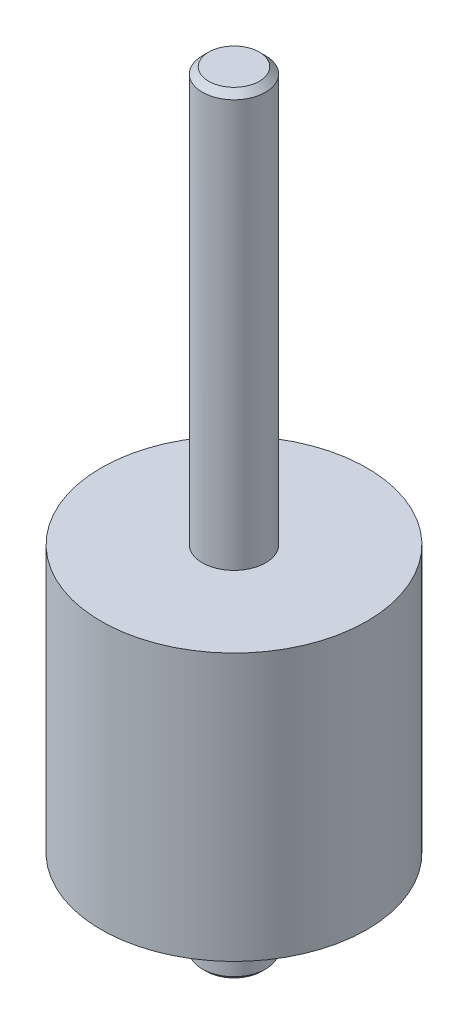
ISO-10303-21;
HEADER;
FILE_DESCRIPTION(('STEP AP214'),'2;1');
FILE_NAME('part.step','',(''),(''),'','','');
FILE_SCHEMA(('AUTOMOTIVE_DESIGN { 1 0 10303 214 1 1 1 1 }'));
ENDSEC;
DATA;
#1=APPLICATION_CONTEXT('core data for automotive mechanical design processes');
#2=APPLICATION_PROTOCOL_DEFINITION('international standard','automotive_design',2000,#1);
#3=PRODUCT_CONTEXT('',#1,'mechanical');
#4=PRODUCT('Part','Part','',(#3));
#5=PRODUCT_RELATED_PRODUCT_CATEGORY('part','',(#4));
#6=PRODUCT_DEFINITION_FORMATION('','',#4);
#7=PRODUCT_DEFINITION_CONTEXT('part definition',#1,'design');
#8=PRODUCT_DEFINITION('design','',#6,#7);
#9=PRODUCT_DEFINITION_SHAPE('','',#8);
#10=(LENGTH_UNIT() NAMED_UNIT(*) SI_UNIT(.MILLI.,.METRE.));
#11=(NAMED_UNIT(*) PLANE_ANGLE_UNIT() SI_UNIT($,.RADIAN.));
#12=(NAMED_UNIT(*) SI_UNIT($,.STERADIAN.) SOLID_ANGLE_UNIT());
#13=UNCERTAINTY_MEASURE_WITH_UNIT(LENGTH_MEASURE(1.E-05),#10,'distance_accuracy_value','');
#14=(GEOMETRIC_REPRESENTATION_CONTEXT(3) GLOBAL_UNCERTAINTY_ASSIGNED_CONTEXT((#13)) GLOBAL_UNIT_ASSIGNED_CONTEXT((#10,
#11,#12)) REPRESENTATION_CONTEXT('',''));
#15=CARTESIAN_POINT('',(0.,0.,0.));
#16=DIRECTION('',(0.,0.,1.));
#17=DIRECTION('',(1.,0.,0.));
#18=AXIS2_PLACEMENT_3D('',#15,#16,#17);
#19=CARTESIAN_POINT('',(0.,-38.6,0.));
#20=DIRECTION('',(0.,1.,0.));
#21=DIRECTION('',(-1.,0.,0.));
#22=AXIS2_PLACEMENT_3D('',#19,#20,#21);
#23=PLANE('',#22);
#24=CARTESIAN_POINT('',(0.,-38.6,0.));
#25=DIRECTION('',(0.,1.,0.));
#26=DIRECTION('',(-1.,0.,0.));
#27=AXIS2_PLACEMENT_3D('',#24,#25,#26);
#28=CIRCLE('',#27,2.2);
#29=CARTESIAN_POINT('',(-2.19999999999999,-38.6,0.));
#30=VERTEX_POINT('',#29);
#31=EDGE_CURVE('E48',#30,#30,#28,.F.);
#32=ORIENTED_EDGE('',*,*,#31,.T.);
#33=EDGE_LOOP('',(#32));
#34=FACE_BOUND('',#33,.T.);
#35=ADVANCED_FACE('F37',(#34),#23,.F.);
#36=CARTESIAN_POINT('',(0.,22.2,0.));
#37=DIRECTION('',(0.,1.,0.));
#38=DIRECTION('',(-1.,0.,0.));
#39=AXIS2_PLACEMENT_3D('',#36,#37,#38);
#40=CYLINDRICAL_SURFACE('',#39,2.5);
#41=CARTESIAN_POINT('',(0.,-38.3,0.));
#42=DIRECTION('',(0.,1.,0.));
#43=DIRECTION('',(-1.,0.,0.));
#44=AXIS2_PLACEMENT_3D('',#41,#42,#43);
#45=CIRCLE('',#44,2.5);
#46=CARTESIAN_POINT('',(-2.49999999999999,-38.3,0.));
#47=VERTEX_POINT('',#46);
#48=EDGE_CURVE('E52',#47,#47,#45,.T.);
#49=ORIENTED_EDGE('',*,*,#48,.T.);
#50=EDGE_LOOP('',(#49));
#51=FACE_BOUND('',#50,.T.);
#52=CARTESIAN_POINT('',(0.,-31.6,0.));
#53=DIRECTION('',(0.,1.,0.));
#54=DIRECTION('',(-1.,0.,0.));
#55=AXIS2_PLACEMENT_3D('',#52,#53,#54);
#56=CIRCLE('',#55,2.5);
#57=CARTESIAN_POINT('',(-2.49999999999999,-31.6,0.));
#58=VERTEX_POINT('',#57);
#59=EDGE_CURVE('E57',#58,#58,#56,.T.);
#60=ORIENTED_EDGE('',*,*,#59,.F.);
#61=EDGE_LOOP('',(#60));
#62=FACE_BOUND('',#61,.T.);
#63=ADVANCED_FACE('F87',(#51,#62),#40,.T.);
#64=CARTESIAN_POINT('',(2.50000000000001,-31.6,0.));
#65=DIRECTION('',(0.,1.,0.));
#66=DIRECTION('',(-1.,0.,0.));
#67=AXIS2_PLACEMENT_3D('',#64,#65,#66);
#68=PLANE('',#67);
#69=CARTESIAN_POINT('',(0.,-31.6,0.));
#70=DIRECTION('',(0.,1.,0.));
#71=DIRECTION('',(-1.,0.,0.));
#72=AXIS2_PLACEMENT_3D('',#69,#70,#71);
#73=CIRCLE('',#72,10.5);
#74=CARTESIAN_POINT('',(-10.5,-31.6,0.));
#75=VERTEX_POINT('',#74);
#76=EDGE_CURVE('E60',#75,#75,#73,.T.);
#77=ORIENTED_EDGE('',*,*,#76,.F.);
#78=EDGE_LOOP('',(#77));
#79=FACE_BOUND('',#78,.T.);
#80=ORIENTED_EDGE('',*,*,#59,.T.);
#81=EDGE_LOOP('',(#80));
#82=FACE_BOUND('',#81,.T.);
#83=ADVANCED_FACE('F81',(#79,#82),#68,.F.);
#84=CARTESIAN_POINT('',(0.,22.2,0.));
#85=DIRECTION('',(0.,1.,0.));
#86=DIRECTION('',(-1.,0.,0.));
#87=AXIS2_PLACEMENT_3D('',#84,#85,#86);
#88=CYLINDRICAL_SURFACE('',#87,10.5);
#89=CARTESIAN_POINT('',(0.,-10.5,0.));
#90=DIRECTION('',(0.,1.,0.));
#91=DIRECTION('',(-1.,0.,0.));
#92=AXIS2_PLACEMENT_3D('',#89,#90,#91);
#93=CIRCLE('',#92,10.5);
#94=CARTESIAN_POINT('',(-10.5,-10.5,0.));
#95=VERTEX_POINT('',#94);
#96=EDGE_CURVE('E63',#95,#95,#93,.T.);
#97=ORIENTED_EDGE('',*,*,#96,.F.);
#98=EDGE_LOOP('',(#97));
#99=FACE_BOUND('',#98,.T.);
#100=ORIENTED_EDGE('',*,*,#76,.T.);
#101=EDGE_LOOP('',(#100));
#102=FACE_BOUND('',#101,.T.);
#103=ADVANCED_FACE('F75',(#99,#102),#88,.T.);
#104=CARTESIAN_POINT('',(10.5,-10.5,0.));
#105=DIRECTION('',(0.,-1.,0.));
#106=DIRECTION('',(1.,0.,0.));
#107=AXIS2_PLACEMENT_3D('',#104,#105,#106);
#108=PLANE('',#107);
#109=CARTESIAN_POINT('',(0.,-10.5,0.));
#110=DIRECTION('',(0.,1.,0.));
#111=DIRECTION('',(-1.,0.,0.));
#112=AXIS2_PLACEMENT_3D('',#109,#110,#111);
#113=CIRCLE('',#112,2.5);
#114=CARTESIAN_POINT('',(-2.5,-10.5,0.));
#115=VERTEX_POINT('',#114);
#116=EDGE_CURVE('E66',#115,#115,#113,.T.);
#117=ORIENTED_EDGE('',*,*,#116,.F.);
#118=EDGE_LOOP('',(#117));
#119=FACE_BOUND('',#118,.T.);
#120=ORIENTED_EDGE('',*,*,#96,.T.);
#121=EDGE_LOOP('',(#120));
#122=FACE_BOUND('',#121,.T.);
#123=ADVANCED_FACE('F72',(#119,#122),#108,.F.);
#124=CARTESIAN_POINT('',(0.,22.2,0.));
#125=DIRECTION('',(0.,1.,0.));
#126=DIRECTION('',(-1.,0.,0.));
#127=AXIS2_PLACEMENT_3D('',#124,#125,#126);
#128=CYLINDRICAL_SURFACE('',#127,2.50000000000001);
#129=CARTESIAN_POINT('',(0.,21.7,0.));
#130=DIRECTION('',(0.,-1.,0.));
#131=DIRECTION('',(1.,0.,0.));
#132=AXIS2_PLACEMENT_3D('',#129,#130,#131);
#133=CIRCLE('',#132,2.50000000000001);
#134=CARTESIAN_POINT('',(2.50000000000001,21.7,0.));
#135=VERTEX_POINT('',#134);
#136=EDGE_CURVE('E10',#135,#135,#133,.T.);
#137=ORIENTED_EDGE('',*,*,#136,.T.);
#138=EDGE_LOOP('',(#137));
#139=FACE_BOUND('',#138,.T.);
#140=ORIENTED_EDGE('',*,*,#116,.T.);
#141=EDGE_LOOP('',(#140));
#142=FACE_BOUND('',#141,.T.);
#143=ADVANCED_FACE('F70',(#139,#142),#128,.T.);
#144=CARTESIAN_POINT('',(2.50000000000001,22.2,0.));
#145=DIRECTION('',(0.,-1.,0.));
#146=DIRECTION('',(1.,0.,0.));
#147=AXIS2_PLACEMENT_3D('',#144,#145,#146);
#148=PLANE('',#147);
#149=CARTESIAN_POINT('',(0.,22.2,0.));
#150=DIRECTION('',(0.,-1.,0.));
#151=DIRECTION('',(1.,0.,0.));
#152=AXIS2_PLACEMENT_3D('',#149,#150,#151);
#153=CIRCLE('',#152,2.00000000000003);
#154=CARTESIAN_POINT('',(2.00000000000003,22.2,0.));
#155=VERTEX_POINT('',#154);
#156=EDGE_CURVE('E44',#155,#155,#153,.F.);
#157=ORIENTED_EDGE('',*,*,#156,.T.);
#158=EDGE_LOOP('',(#157));
#159=FACE_BOUND('',#158,.T.);
#160=ADVANCED_FACE('F101',(#159),#148,.F.);
#161=CARTESIAN_POINT('',(0.,-38.3,0.));
#162=DIRECTION('',(0.,1.,0.));
#163=DIRECTION('',(-1.,0.,0.));
#164=AXIS2_PLACEMENT_3D('',#161,#162,#163);
#165=CONICAL_SURFACE('',#164,2.5,0.785398163397446);
#166=ORIENTED_EDGE('',*,*,#31,.F.);
#167=EDGE_LOOP('',(#166));
#168=FACE_BOUND('',#167,.T.);
#169=ORIENTED_EDGE('',*,*,#48,.F.);
#170=EDGE_LOOP('',(#169));
#171=FACE_BOUND('',#170,.T.);
#172=ADVANCED_FACE('F99',(#168,#171),#165,.T.);
#173=CARTESIAN_POINT('',(0.,22.2,0.));
#174=DIRECTION('',(0.,-1.,0.));
#175=DIRECTION('',(1.,0.,0.));
#176=AXIS2_PLACEMENT_3D('',#173,#174,#175);
#177=CONICAL_SURFACE('',#176,2.00000000000003,0.785398163397438);
#178=ORIENTED_EDGE('',*,*,#136,.F.);
#179=EDGE_LOOP('',(#178));
#180=FACE_BOUND('',#179,.T.);
#181=ORIENTED_EDGE('',*,*,#156,.F.);
#182=EDGE_LOOP('',(#181));
#183=FACE_BOUND('',#182,.T.);
#184=ADVANCED_FACE('F39',(#180,#183),#177,.T.);
#185=CLOSED_SHELL('',(#35,#63,#83,#103,#123,#143,#160,#172,#184));
#186=MANIFOLD_SOLID_BREP('B2',#185);
#187=ADVANCED_BREP_SHAPE_REPRESENTATION('',(#18,#186),#14);
#188=SHAPE_DEFINITION_REPRESENTATION(#9,#187);
ENDSEC;
END-ISO-10303-21;
